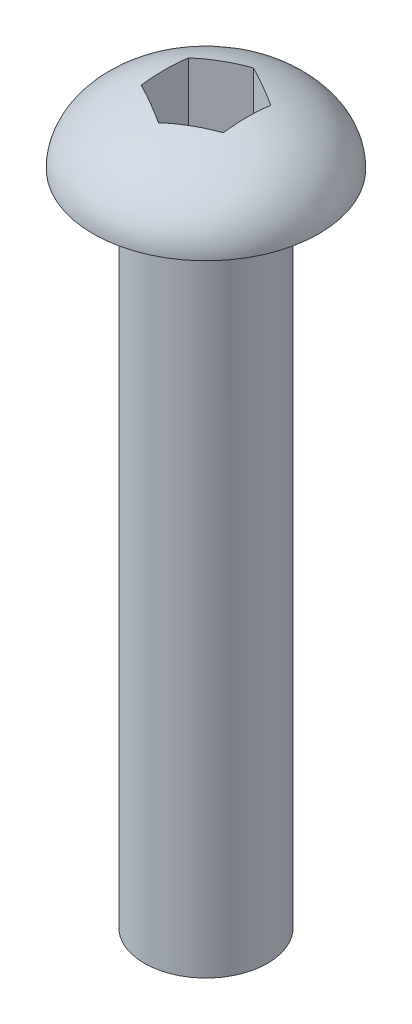
ISO-10303-21;
HEADER;
FILE_DESCRIPTION(('STEP AP214'),'2;1');
FILE_NAME('part.step','',(''),(''),'','','');
FILE_SCHEMA(('AUTOMOTIVE_DESIGN { 1 0 10303 214 1 1 1 1 }'));
ENDSEC;
DATA;
#1=APPLICATION_CONTEXT('core data for automotive mechanical design processes');
#2=APPLICATION_PROTOCOL_DEFINITION('international standard','automotive_design',2000,#1);
#3=PRODUCT_CONTEXT('',#1,'mechanical');
#4=PRODUCT('Part','Part','',(#3));
#5=PRODUCT_RELATED_PRODUCT_CATEGORY('part','',(#4));
#6=PRODUCT_DEFINITION_FORMATION('','',#4);
#7=PRODUCT_DEFINITION_CONTEXT('part definition',#1,'design');
#8=PRODUCT_DEFINITION('design','',#6,#7);
#9=PRODUCT_DEFINITION_SHAPE('','',#8);
#10=(LENGTH_UNIT() NAMED_UNIT(*) SI_UNIT(.MILLI.,.METRE.));
#11=(NAMED_UNIT(*) PLANE_ANGLE_UNIT() SI_UNIT($,.RADIAN.));
#12=(NAMED_UNIT(*) SI_UNIT($,.STERADIAN.) SOLID_ANGLE_UNIT());
#13=UNCERTAINTY_MEASURE_WITH_UNIT(LENGTH_MEASURE(1.E-05),#10,'distance_accuracy_value','');
#14=(GEOMETRIC_REPRESENTATION_CONTEXT(3) GLOBAL_UNCERTAINTY_ASSIGNED_CONTEXT((#13)) GLOBAL_UNIT_ASSIGNED_CONTEXT((#10,
#11,#12)) REPRESENTATION_CONTEXT('',''));
#15=CARTESIAN_POINT('',(0.,0.,0.));
#16=DIRECTION('',(0.,0.,1.));
#17=DIRECTION('',(1.,0.,0.));
#18=AXIS2_PLACEMENT_3D('',#15,#16,#17);
#19=CARTESIAN_POINT('',(0.,16.,0.));
#20=DIRECTION('',(1.,0.,0.));
#21=DIRECTION('',(0.,0.,1.));
#22=AXIS2_PLACEMENT_3D('',#19,#20,#21);
#23=ELLIPSE('',#22,2.75,1.7);
#24=TRIMMED_CURVE('',#23,(PARAMETER_VALUE(4.71238898038469)),
(PARAMETER_VALUE(7.85398163397448)),.T.,.PARAMETER.);
#25=CARTESIAN_POINT('',(0.,14.3,0.));
#26=DIRECTION('',(0.,1.,0.));
#27=AXIS1_PLACEMENT('',#25,#26);
#28=SURFACE_OF_REVOLUTION('',#24,#27);
#29=CARTESIAN_POINT('',(0.,16.,0.));
#30=DIRECTION('',(0.,-1.,0.));
#31=DIRECTION('',(0.,0.,-1.));
#32=AXIS2_PLACEMENT_3D('',#29,#30,#31);
#33=CIRCLE('',#32,2.75);
#34=CARTESIAN_POINT('',(0.,16.,-2.75));
#35=VERTEX_POINT('',#34);
#36=EDGE_CURVE('E111',#35,#35,#33,.T.);
#37=ORIENTED_EDGE('',*,*,#36,.F.);
#38=EDGE_LOOP('',(#37));
#39=FACE_BOUND('',#38,.T.);
#40=CARTESIAN_POINT('',(-0.999999999999999,17.5428766378292,0.577350269189626));
#41=CARTESIAN_POINT('',(-0.999999999999999,17.5517804090184,0.515053687121891));
#42=CARTESIAN_POINT('',(-0.999999999999999,17.5592031137414,0.452560413875274));
#43=CARTESIAN_POINT('',(-0.999999999999999,17.5711314043237,0.327291050253385));
#44=CARTESIAN_POINT('',(-0.999999999999999,17.5756367771672,0.264514939562992));
#45=CARTESIAN_POINT('',(-0.999999999999999,17.5848015833247,0.0767863528832355));
#46=CARTESIAN_POINT('',(-0.999999999999999,17.5852278716277,-0.0484064378330017));
#47=CARTESIAN_POINT('',(-0.999999999999999,17.5771619401964,-0.240800717969126));
#48=CARTESIAN_POINT('',(-0.999999999999999,17.5726800099057,-0.308200963473546));
#49=CARTESIAN_POINT('',(-0.999999999999999,17.5603375226088,-0.442927611147888));
#50=CARTESIAN_POINT('',(-0.999999999999999,17.5524652512756,-0.510252938316719));
#51=CARTESIAN_POINT('',(-0.999999999999998,17.5428766378292,-0.577350269189626));
#52=B_SPLINE_CURVE_WITH_KNOTS('',3,(#40,#41,#42,#43,#44,#45,#46,#47,#48,#49,#50,#51),
.UNSPECIFIED.,.F.,.F.,(4,2,2,2,2,4),(0.,0.188743111574301,0.37750000311769,0.752478031569035,
0.955055075702625,1.15833775268432),.UNSPECIFIED.);
#53=CARTESIAN_POINT('',(-0.999999999999999,17.5428766378292,0.577350269189626));
#54=VERTEX_POINT('',#53);
#55=CARTESIAN_POINT('',(-0.999999999999998,17.5428766378292,-0.577350269189626));
#56=VERTEX_POINT('',#55);
#57=EDGE_CURVE('E121',#54,#56,#52,.T.);
#58=ORIENTED_EDGE('',*,*,#57,.T.);
#59=CARTESIAN_POINT('',(-0.999999999999998,17.5428766378292,-0.577350269189626));
#60=CARTESIAN_POINT('',(-0.946049577360397,17.5517804090184,-0.608498560223495));
#61=CARTESIAN_POINT('',(-0.891928815163185,17.5592031137414,-0.639745196846803));
#62=CARTESIAN_POINT('',(-0.783442363950718,17.5711314043237,-0.702379878657748));
#63=CARTESIAN_POINT('',(-0.729076657342053,17.5756367771672,-0.733767934002944));
#64=CARTESIAN_POINT('',(-0.566498932260834,17.5848015833247,-0.827632227342823));
#65=CARTESIAN_POINT('',(-0.458078795129904,17.5852278716277,-0.890228622700942));
#66=CARTESIAN_POINT('',(-0.291460460989201,17.5771619401964,-0.986425762769003));
#67=CARTESIAN_POINT('',(-0.233090136161067,17.5726800099057,-1.02012588552121));
#68=CARTESIAN_POINT('',(-0.116413436708374,17.5603375226088,-1.08748920935838));
#69=CARTESIAN_POINT('',(-0.0581079930620684,17.5524652512756,-1.1211518729428));
#70=CARTESIAN_POINT('',(0.,17.5428766378292,-1.15470053837925));
#71=B_SPLINE_CURVE_WITH_KNOTS('',3,(#59,#60,#61,#62,#63,#64,#65,#66,#67,#68,#69,#70),
.UNSPECIFIED.,.F.,.F.,(4,2,2,2,2,4),(0.,0.188743111574301,0.377500003117691,0.752478031569038,
0.955055075702624,1.15833775268431),.UNSPECIFIED.);
#72=CARTESIAN_POINT('',(0.,17.5428766378292,-1.15470053837925));
#73=VERTEX_POINT('',#72);
#74=EDGE_CURVE('E11',#56,#73,#71,.T.);
#75=ORIENTED_EDGE('',*,*,#74,.T.);
#76=CARTESIAN_POINT('',(0.,17.5428766378292,-1.15470053837925));
#77=CARTESIAN_POINT('',(0.0539504226396013,17.5517804090184,-1.12355224734538));
#78=CARTESIAN_POINT('',(0.108071184836813,17.5592031137414,-1.09230561072208));
#79=CARTESIAN_POINT('',(0.21655763604928,17.5711314043237,-1.02967092891113));
#80=CARTESIAN_POINT('',(0.270923342657944,17.5756367771672,-0.998282873565934));
#81=CARTESIAN_POINT('',(0.433501067739163,17.5848015833247,-0.904418580226055));
#82=CARTESIAN_POINT('',(0.541921204870093,17.5852278716277,-0.841822184867938));
#83=CARTESIAN_POINT('',(0.708539539010796,17.5771619401964,-0.745625044799875));
#84=CARTESIAN_POINT('',(0.766909863838931,17.5726800099057,-0.711924922047665));
#85=CARTESIAN_POINT('',(0.883586563291626,17.5603375226088,-0.644561598210494));
#86=CARTESIAN_POINT('',(0.941892006937932,17.5524652512756,-0.610898934626078));
#87=CARTESIAN_POINT('',(0.999999999999999,17.5428766378292,-0.577350269189625));
#88=B_SPLINE_CURVE_WITH_KNOTS('',3,(#76,#77,#78,#79,#80,#81,#82,#83,#84,#85,#86,#87),
.UNSPECIFIED.,.F.,.F.,(4,2,2,2,2,4),(0.,0.188743111574301,0.37750000311769,0.752478031569036,
0.955055075702624,1.15833775268432),.UNSPECIFIED.);
#89=CARTESIAN_POINT('',(1.,17.5428766378292,-0.577350269189625));
#90=VERTEX_POINT('',#89);
#91=EDGE_CURVE('E47',#73,#90,#88,.T.);
#92=ORIENTED_EDGE('',*,*,#91,.T.);
#93=CARTESIAN_POINT('',(0.999999999999999,17.5428766378292,-0.577350269189625));
#94=CARTESIAN_POINT('',(1.,17.5517804090184,-0.51505368712189));
#95=CARTESIAN_POINT('',(1.,17.5592031137414,-0.452560413875273));
#96=CARTESIAN_POINT('',(1.,17.5711314043237,-0.327291050253384));
#97=CARTESIAN_POINT('',(1.,17.5756367771672,-0.26451493956299));
#98=CARTESIAN_POINT('',(1.,17.5848015833247,-0.0767863528832336));
#99=CARTESIAN_POINT('',(1.,17.5852278716277,0.0484064378330036));
#100=CARTESIAN_POINT('',(1.,17.5771619401964,0.240800717969128));
#101=CARTESIAN_POINT('',(1.,17.5726800099057,0.308200963473547));
#102=CARTESIAN_POINT('',(0.999999999999999,17.5603375226088,0.442927611147888));
#103=CARTESIAN_POINT('',(0.999999999999999,17.5524652512756,0.510252938316719));
#104=CARTESIAN_POINT('',(0.999999999999999,17.5428766378292,0.577350269189626));
#105=B_SPLINE_CURVE_WITH_KNOTS('',3,(#93,#94,#95,#96,#97,#98,#99,#100,#101,#102,#103,#104),
.UNSPECIFIED.,.F.,.F.,(4,2,2,2,2,4),(0.,0.188743111574301,0.37750000311769,0.752478031569036,
0.955055075702625,1.15833775268432),.UNSPECIFIED.);
#106=CARTESIAN_POINT('',(1.,17.5428766378292,0.577350269189626));
#107=VERTEX_POINT('',#106);
#108=EDGE_CURVE('E162',#90,#107,#105,.T.);
#109=ORIENTED_EDGE('',*,*,#108,.T.);
#110=CARTESIAN_POINT('',(0.999999999999999,17.5428766378292,0.577350269189626));
#111=CARTESIAN_POINT('',(0.946049577360398,17.5517804090184,0.608498560223494));
#112=CARTESIAN_POINT('',(0.891928815163186,17.5592031137414,0.639745196846802));
#113=CARTESIAN_POINT('',(0.78344236395072,17.5711314043237,0.702379878657746));
#114=CARTESIAN_POINT('',(0.729076657342055,17.5756367771672,0.733767934002943));
#115=CARTESIAN_POINT('',(0.566498932260837,17.5848015833247,0.827632227342822));
#116=CARTESIAN_POINT('',(0.458078795129907,17.5852278716277,0.890228622700941));
#117=CARTESIAN_POINT('',(0.291460460989204,17.5771619401964,0.986425762769002));
#118=CARTESIAN_POINT('',(0.23309013616107,17.5726800099057,1.02012588552121));
#119=CARTESIAN_POINT('',(0.116413436708375,17.5603375226088,1.08748920935838));
#120=CARTESIAN_POINT('',(0.0581079930620684,17.5524652512756,1.1211518729428));
#121=CARTESIAN_POINT('',(0.,17.5428766378292,1.15470053837925));
#122=B_SPLINE_CURVE_WITH_KNOTS('',3,(#110,#111,#112,#113,#114,#115,#116,#117,#118,#119,#120,
#121),.UNSPECIFIED.,.F.,.F.,(4,2,2,2,2,4),(0.,0.188743111574301,0.37750000311769,
0.752478031569035,0.955055075702623,1.15833775268431),.UNSPECIFIED.);
#123=CARTESIAN_POINT('',(0.,17.5428766378292,1.15470053837925));
#124=VERTEX_POINT('',#123);
#125=EDGE_CURVE('E155',#107,#124,#122,.T.);
#126=ORIENTED_EDGE('',*,*,#125,.T.);
#127=CARTESIAN_POINT('',(0.,17.5428766378292,1.15470053837925));
#128=CARTESIAN_POINT('',(-0.0539504226396036,17.5517804090184,1.12355224734538));
#129=CARTESIAN_POINT('',(-0.108071184836817,17.5592031137414,1.09230561072207));
#130=CARTESIAN_POINT('',(-0.216557636049284,17.5711314043237,1.02967092891113));
#131=CARTESIAN_POINT('',(-0.270923342657948,17.5756367771672,0.998282873565932));
#132=CARTESIAN_POINT('',(-0.433501067739167,17.5848015833247,0.904418580226053));
#133=CARTESIAN_POINT('',(-0.541921204870097,17.5852278716277,0.841822184867934));
#134=CARTESIAN_POINT('',(-0.7085395390108,17.5771619401964,0.745625044799873));
#135=CARTESIAN_POINT('',(-0.766909863838934,17.5726800099057,0.711924922047664));
#136=CARTESIAN_POINT('',(-0.883586563291627,17.5603375226088,0.644561598210495));
#137=CARTESIAN_POINT('',(-0.941892006937933,17.5524652512756,0.610898934626079));
#138=CARTESIAN_POINT('',(-0.999999999999998,17.5428766378292,0.577350269189626));
#139=B_SPLINE_CURVE_WITH_KNOTS('',3,(#127,#128,#129,#130,#131,#132,#133,#134,#135,#136,#137,
#138),.UNSPECIFIED.,.F.,.F.,(4,2,2,2,2,4),(0.,0.188743111574302,0.377500003117691,
0.752478031569038,0.955055075702623,1.15833775268431),.UNSPECIFIED.);
#140=EDGE_CURVE('E131',#124,#54,#139,.T.);
#141=ORIENTED_EDGE('',*,*,#140,.T.);
#142=EDGE_LOOP('',(#58,#75,#92,#109,#126,#141));
#143=FACE_BOUND('',#142,.T.);
#144=ADVANCED_FACE('F33',(#39,#143),#28,.F.);
#145=CARTESIAN_POINT('',(0.,16.,0.));
#146=DIRECTION('',(0.,-1.,0.));
#147=DIRECTION('',(0.,0.,-1.));
#148=AXIS2_PLACEMENT_3D('',#145,#146,#147);
#149=CYLINDRICAL_SURFACE('',#148,1.5);
#150=CARTESIAN_POINT('',(0.,0.,0.));
#151=DIRECTION('',(0.,1.,0.));
#152=DIRECTION('',(0.,0.,1.));
#153=AXIS2_PLACEMENT_3D('',#150,#151,#152);
#154=CIRCLE('',#153,1.5);
#155=CARTESIAN_POINT('',(0.,0.,1.5));
#156=VERTEX_POINT('',#155);
#157=EDGE_CURVE('E119',#156,#156,#154,.T.);
#158=ORIENTED_EDGE('',*,*,#157,.T.);
#159=EDGE_LOOP('',(#158));
#160=FACE_BOUND('',#159,.T.);
#161=CARTESIAN_POINT('',(0.,16.,0.));
#162=DIRECTION('',(0.,-1.,0.));
#163=DIRECTION('',(0.,0.,-1.));
#164=AXIS2_PLACEMENT_3D('',#161,#162,#163);
#165=CIRCLE('',#164,1.5);
#166=CARTESIAN_POINT('',(0.,16.,-1.5));
#167=VERTEX_POINT('',#166);
#168=EDGE_CURVE('E107',#167,#167,#165,.T.);
#169=ORIENTED_EDGE('',*,*,#168,.T.);
#170=EDGE_LOOP('',(#169));
#171=FACE_BOUND('',#170,.T.);
#172=ADVANCED_FACE('F183',(#160,#171),#149,.T.);
#173=CARTESIAN_POINT('',(0.,0.,0.));
#174=DIRECTION('',(0.,1.,0.));
#175=DIRECTION('',(0.,0.,1.));
#176=AXIS2_PLACEMENT_3D('',#173,#174,#175);
#177=PLANE('',#176);
#178=ORIENTED_EDGE('',*,*,#157,.F.);
#179=EDGE_LOOP('',(#178));
#180=FACE_BOUND('',#179,.T.);
#181=ADVANCED_FACE('F180',(#180),#177,.F.);
#182=CARTESIAN_POINT('',(0.,16.,0.));
#183=DIRECTION('',(0.,-1.,0.));
#184=DIRECTION('',(0.,0.,-1.));
#185=AXIS2_PLACEMENT_3D('',#182,#183,#184);
#186=PLANE('',#185);
#187=ORIENTED_EDGE('',*,*,#168,.F.);
#188=EDGE_LOOP('',(#187));
#189=FACE_BOUND('',#188,.T.);
#190=ORIENTED_EDGE('',*,*,#36,.T.);
#191=EDGE_LOOP('',(#190));
#192=FACE_BOUND('',#191,.T.);
#193=ADVANCED_FACE('F177',(#189,#192),#186,.T.);
#194=CARTESIAN_POINT('',(-0.999999999999999,15.7,-0.577350269189626));
#195=DIRECTION('',(0.5,0.,0.866025403784439));
#196=DIRECTION('',(0.866025403784439,0.,-0.5));
#197=AXIS2_PLACEMENT_3D('',#194,#195,#196);
#198=PLANE('',#197);
#199=DIRECTION('',(0.,1.,0.));
#200=VECTOR('',#199,1.);
#201=CARTESIAN_POINT('',(-0.999999999999999,15.7,-0.577350269189626));
#202=LINE('',#201,#200);
#203=CARTESIAN_POINT('',(-0.999999999999999,15.7,-0.577350269189626));
#204=VERTEX_POINT('',#203);
#205=EDGE_CURVE('E54',#204,#56,#202,.T.);
#206=ORIENTED_EDGE('',*,*,#205,.F.);
#207=DIRECTION('',(0.866025403784439,0.,-0.5));
#208=VECTOR('',#207,1.);
#209=CARTESIAN_POINT('',(-0.999999999999999,15.7,-0.577350269189626));
#210=LINE('',#209,#208);
#211=CARTESIAN_POINT('',(0.,15.7,-1.15470053837925));
#212=VERTEX_POINT('',#211);
#213=EDGE_CURVE('E97',#204,#212,#210,.T.);
#214=ORIENTED_EDGE('',*,*,#213,.T.);
#215=DIRECTION('',(0.,1.,0.));
#216=VECTOR('',#215,1.);
#217=CARTESIAN_POINT('',(0.,15.7,-1.15470053837925));
#218=LINE('',#217,#216);
#219=EDGE_CURVE('E104',#212,#73,#218,.T.);
#220=ORIENTED_EDGE('',*,*,#219,.T.);
#221=ORIENTED_EDGE('',*,*,#74,.F.);
#222=EDGE_LOOP('',(#206,#214,#220,#221));
#223=FACE_BOUND('',#222,.T.);
#224=ADVANCED_FACE('F103',(#223),#198,.T.);
#225=CARTESIAN_POINT('',(0.,15.7,-1.15470053837925));
#226=DIRECTION('',(-0.5,0.,0.866025403784439));
#227=DIRECTION('',(0.866025403784438,0.,0.5));
#228=AXIS2_PLACEMENT_3D('',#225,#226,#227);
#229=PLANE('',#228);
#230=ORIENTED_EDGE('',*,*,#219,.F.);
#231=DIRECTION('',(0.866025403784438,0.,0.5));
#232=VECTOR('',#231,1.);
#233=CARTESIAN_POINT('',(0.,15.7,-1.15470053837925));
#234=LINE('',#233,#232);
#235=CARTESIAN_POINT('',(1.,15.7,-0.577350269189625));
#236=VERTEX_POINT('',#235);
#237=EDGE_CURVE('E93',#212,#236,#234,.T.);
#238=ORIENTED_EDGE('',*,*,#237,.T.);
#239=DIRECTION('',(0.,1.,0.));
#240=VECTOR('',#239,1.);
#241=CARTESIAN_POINT('',(1.,15.7,-0.577350269189625));
#242=LINE('',#241,#240);
#243=EDGE_CURVE('E108',#236,#90,#242,.T.);
#244=ORIENTED_EDGE('',*,*,#243,.T.);
#245=ORIENTED_EDGE('',*,*,#91,.F.);
#246=EDGE_LOOP('',(#230,#238,#244,#245));
#247=FACE_BOUND('',#246,.T.);
#248=ADVANCED_FACE('F106',(#247),#229,.T.);
#249=CARTESIAN_POINT('',(1.,15.7,-0.577350269189625));
#250=DIRECTION('',(-1.,0.,0.));
#251=DIRECTION('',(0.,0.,1.));
#252=AXIS2_PLACEMENT_3D('',#249,#250,#251);
#253=PLANE('',#252);
#254=ORIENTED_EDGE('',*,*,#243,.F.);
#255=DIRECTION('',(0.,0.,1.));
#256=VECTOR('',#255,1.);
#257=CARTESIAN_POINT('',(1.,15.7,-0.577350269189625));
#258=LINE('',#257,#256);
#259=CARTESIAN_POINT('',(1.,15.7,0.577350269189626));
#260=VERTEX_POINT('',#259);
#261=EDGE_CURVE('E99',#236,#260,#258,.T.);
#262=ORIENTED_EDGE('',*,*,#261,.T.);
#263=DIRECTION('',(0.,1.,0.));
#264=VECTOR('',#263,1.);
#265=CARTESIAN_POINT('',(1.,15.7,0.577350269189626));
#266=LINE('',#265,#264);
#267=EDGE_CURVE('E113',#260,#107,#266,.T.);
#268=ORIENTED_EDGE('',*,*,#267,.T.);
#269=ORIENTED_EDGE('',*,*,#108,.F.);
#270=EDGE_LOOP('',(#254,#262,#268,#269));
#271=FACE_BOUND('',#270,.T.);
#272=ADVANCED_FACE('F151',(#271),#253,.T.);
#273=CARTESIAN_POINT('',(1.,15.7,0.577350269189626));
#274=DIRECTION('',(-0.5,0.,-0.866025403784439));
#275=DIRECTION('',(-0.866025403784439,0.,0.5));
#276=AXIS2_PLACEMENT_3D('',#273,#274,#275);
#277=PLANE('',#276);
#278=ORIENTED_EDGE('',*,*,#267,.F.);
#279=DIRECTION('',(-0.866025403784439,0.,0.5));
#280=VECTOR('',#279,1.);
#281=CARTESIAN_POINT('',(1.,15.7,0.577350269189626));
#282=LINE('',#281,#280);
#283=CARTESIAN_POINT('',(0.,15.7,1.15470053837925));
#284=VERTEX_POINT('',#283);
#285=EDGE_CURVE('E214',#260,#284,#282,.T.);
#286=ORIENTED_EDGE('',*,*,#285,.T.);
#287=DIRECTION('',(0.,1.,0.));
#288=VECTOR('',#287,1.);
#289=CARTESIAN_POINT('',(0.,15.7,1.15470053837925));
#290=LINE('',#289,#288);
#291=EDGE_CURVE('E205',#284,#124,#290,.T.);
#292=ORIENTED_EDGE('',*,*,#291,.T.);
#293=ORIENTED_EDGE('',*,*,#125,.F.);
#294=EDGE_LOOP('',(#278,#286,#292,#293));
#295=FACE_BOUND('',#294,.T.);
#296=ADVANCED_FACE('F146',(#295),#277,.T.);
#297=CARTESIAN_POINT('',(0.,15.7,1.15470053837925));
#298=DIRECTION('',(0.5,0.,-0.866025403784439));
#299=DIRECTION('',(-0.866025403784439,0.,-0.5));
#300=AXIS2_PLACEMENT_3D('',#297,#298,#299);
#301=PLANE('',#300);
#302=ORIENTED_EDGE('',*,*,#291,.F.);
#303=DIRECTION('',(-0.866025403784439,0.,-0.5));
#304=VECTOR('',#303,1.);
#305=CARTESIAN_POINT('',(0.,15.7,1.15470053837925));
#306=LINE('',#305,#304);
#307=CARTESIAN_POINT('',(-0.999999999999999,15.7,0.577350269189626));
#308=VERTEX_POINT('',#307);
#309=EDGE_CURVE('E204',#284,#308,#306,.T.);
#310=ORIENTED_EDGE('',*,*,#309,.T.);
#311=DIRECTION('',(0.,1.,0.));
#312=VECTOR('',#311,1.);
#313=CARTESIAN_POINT('',(-0.999999999999999,15.7,0.577350269189626));
#314=LINE('',#313,#312);
#315=EDGE_CURVE('E200',#308,#54,#314,.T.);
#316=ORIENTED_EDGE('',*,*,#315,.T.);
#317=ORIENTED_EDGE('',*,*,#140,.F.);
#318=EDGE_LOOP('',(#302,#310,#316,#317));
#319=FACE_BOUND('',#318,.T.);
#320=ADVANCED_FACE('F142',(#319),#301,.T.);
#321=CARTESIAN_POINT('',(-0.999999999999999,15.7,0.577350269189626));
#322=DIRECTION('',(1.,0.,0.));
#323=DIRECTION('',(0.,0.,-1.));
#324=AXIS2_PLACEMENT_3D('',#321,#322,#323);
#325=PLANE('',#324);
#326=ORIENTED_EDGE('',*,*,#315,.F.);
#327=DIRECTION('',(0.,0.,-1.));
#328=VECTOR('',#327,1.);
#329=CARTESIAN_POINT('',(-0.999999999999999,15.7,0.577350269189626));
#330=LINE('',#329,#328);
#331=EDGE_CURVE('E208',#308,#204,#330,.T.);
#332=ORIENTED_EDGE('',*,*,#331,.T.);
#333=ORIENTED_EDGE('',*,*,#205,.T.);
#334=ORIENTED_EDGE('',*,*,#57,.F.);
#335=EDGE_LOOP('',(#326,#332,#333,#334));
#336=FACE_BOUND('',#335,.T.);
#337=ADVANCED_FACE('F138',(#336),#325,.T.);
#338=CARTESIAN_POINT('',(0.,15.7,0.));
#339=DIRECTION('',(0.,-1.,0.));
#340=DIRECTION('',(0.,0.,-1.));
#341=AXIS2_PLACEMENT_3D('',#338,#339,#340);
#342=PLANE('',#341);
#343=ORIENTED_EDGE('',*,*,#213,.F.);
#344=ORIENTED_EDGE('',*,*,#331,.F.);
#345=ORIENTED_EDGE('',*,*,#309,.F.);
#346=ORIENTED_EDGE('',*,*,#285,.F.);
#347=ORIENTED_EDGE('',*,*,#261,.F.);
#348=ORIENTED_EDGE('',*,*,#237,.F.);
#349=EDGE_LOOP('',(#343,#344,#345,#346,#347,#348));
#350=FACE_BOUND('',#349,.T.);
#351=ADVANCED_FACE('F95',(#350),#342,.F.);
#352=CLOSED_SHELL('',(#144,#172,#181,#193,#224,#248,#272,#296,#320,#337,#351));
#353=MANIFOLD_SOLID_BREP('B2',#352);
#354=ADVANCED_BREP_SHAPE_REPRESENTATION('',(#18,#353),#14);
#355=SHAPE_DEFINITION_REPRESENTATION(#9,#354);
ENDSEC;
END-ISO-10303-21;
